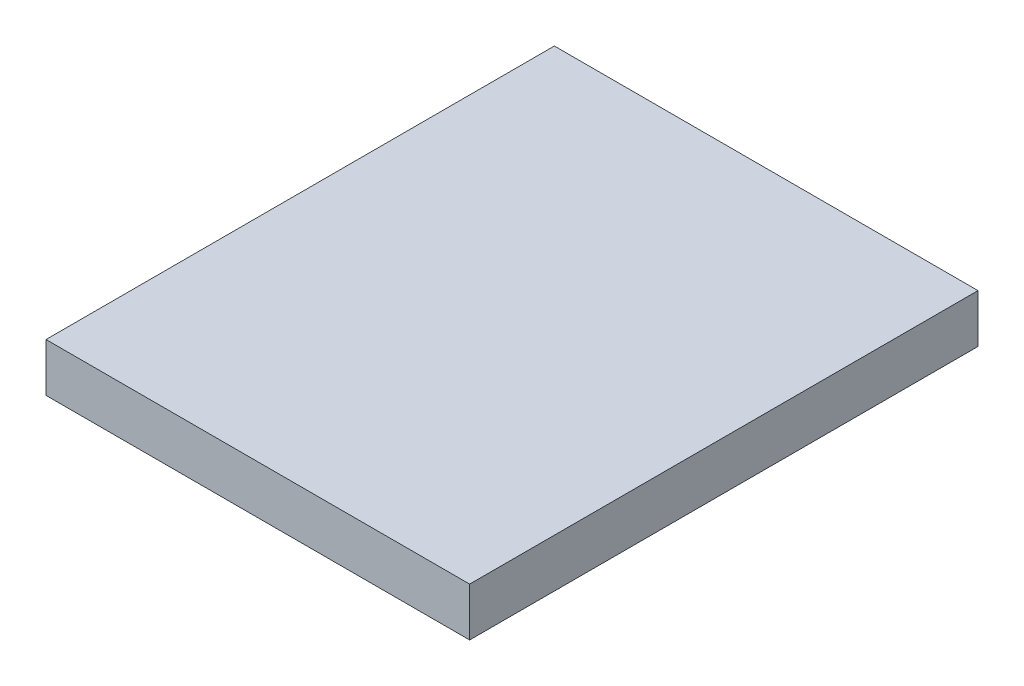
ISO-10303-21;
HEADER;
FILE_DESCRIPTION(('STEP AP214'),'2;1');
FILE_NAME('part.step','',(''),(''),'','','');
FILE_SCHEMA(('AUTOMOTIVE_DESIGN { 1 0 10303 214 1 1 1 1 }'));
ENDSEC;
DATA;
#1=APPLICATION_CONTEXT('core data for automotive mechanical design processes');
#2=APPLICATION_PROTOCOL_DEFINITION('international standard','automotive_design',2000,#1);
#3=PRODUCT_CONTEXT('',#1,'mechanical');
#4=PRODUCT('Part','Part','',(#3));
#5=PRODUCT_RELATED_PRODUCT_CATEGORY('part','',(#4));
#6=PRODUCT_DEFINITION_FORMATION('','',#4);
#7=PRODUCT_DEFINITION_CONTEXT('part definition',#1,'design');
#8=PRODUCT_DEFINITION('design','',#6,#7);
#9=PRODUCT_DEFINITION_SHAPE('','',#8);
#10=(LENGTH_UNIT() NAMED_UNIT(*) SI_UNIT(.MILLI.,.METRE.));
#11=(NAMED_UNIT(*) PLANE_ANGLE_UNIT() SI_UNIT($,.RADIAN.));
#12=(NAMED_UNIT(*) SI_UNIT($,.STERADIAN.) SOLID_ANGLE_UNIT());
#13=UNCERTAINTY_MEASURE_WITH_UNIT(LENGTH_MEASURE(1.E-05),#10,'distance_accuracy_value','');
#14=(GEOMETRIC_REPRESENTATION_CONTEXT(3) GLOBAL_UNCERTAINTY_ASSIGNED_CONTEXT((#13)) GLOBAL_UNIT_ASSIGNED_CONTEXT((#10,
#11,#12)) REPRESENTATION_CONTEXT('',''));
#15=CARTESIAN_POINT('',(0.,0.,0.));
#16=DIRECTION('',(0.,0.,1.));
#17=DIRECTION('',(1.,0.,0.));
#18=AXIS2_PLACEMENT_3D('',#15,#16,#17);
#19=CARTESIAN_POINT('',(0.,4.,0.));
#20=DIRECTION('',(1.,0.,0.));
#21=DIRECTION('',(0.,0.,-1.));
#22=AXIS2_PLACEMENT_3D('',#19,#20,#21);
#23=PLANE('',#22);
#24=DIRECTION('',(0.,0.,1.));
#25=VECTOR('',#24,1.);
#26=CARTESIAN_POINT('',(0.,0.,0.));
#27=LINE('',#26,#25);
#28=CARTESIAN_POINT('',(0.,0.,-42.));
#29=VERTEX_POINT('',#28);
#30=CARTESIAN_POINT('',(0.,0.,0.));
#31=VERTEX_POINT('',#30);
#32=EDGE_CURVE('E96',#29,#31,#27,.T.);
#33=ORIENTED_EDGE('',*,*,#32,.T.);
#34=DIRECTION('',(0.,-1.,0.));
#35=VECTOR('',#34,1.);
#36=CARTESIAN_POINT('',(0.,4.,0.));
#37=LINE('',#36,#35);
#38=CARTESIAN_POINT('',(0.,4.,0.));
#39=VERTEX_POINT('',#38);
#40=EDGE_CURVE('E11',#39,#31,#37,.T.);
#41=ORIENTED_EDGE('',*,*,#40,.F.);
#42=DIRECTION('',(0.,0.,1.));
#43=VECTOR('',#42,1.);
#44=CARTESIAN_POINT('',(0.,4.,0.));
#45=LINE('',#44,#43);
#46=CARTESIAN_POINT('',(0.,4.,-42.));
#47=VERTEX_POINT('',#46);
#48=EDGE_CURVE('E84',#47,#39,#45,.T.);
#49=ORIENTED_EDGE('',*,*,#48,.F.);
#50=DIRECTION('',(0.,-1.,0.));
#51=VECTOR('',#50,1.);
#52=CARTESIAN_POINT('',(0.,4.,-42.));
#53=LINE('',#52,#51);
#54=EDGE_CURVE('E92',#47,#29,#53,.T.);
#55=ORIENTED_EDGE('',*,*,#54,.T.);
#56=EDGE_LOOP('',(#33,#41,#49,#55));
#57=FACE_BOUND('',#56,.T.);
#58=ADVANCED_FACE('F33',(#57),#23,.F.);
#59=CARTESIAN_POINT('',(0.,4.,0.));
#60=DIRECTION('',(0.,0.,-1.));
#61=DIRECTION('',(-1.,0.,0.));
#62=AXIS2_PLACEMENT_3D('',#59,#60,#61);
#63=PLANE('',#62);
#64=DIRECTION('',(1.,0.,0.));
#65=VECTOR('',#64,1.);
#66=CARTESIAN_POINT('',(0.,0.,0.));
#67=LINE('',#66,#65);
#68=CARTESIAN_POINT('',(35.,0.,0.));
#69=VERTEX_POINT('',#68);
#70=EDGE_CURVE('E88',#31,#69,#67,.T.);
#71=ORIENTED_EDGE('',*,*,#70,.T.);
#72=DIRECTION('',(0.,-1.,0.));
#73=VECTOR('',#72,1.);
#74=CARTESIAN_POINT('',(35.,4.,0.));
#75=LINE('',#74,#73);
#76=CARTESIAN_POINT('',(35.,4.,0.));
#77=VERTEX_POINT('',#76);
#78=EDGE_CURVE('E41',#77,#69,#75,.T.);
#79=ORIENTED_EDGE('',*,*,#78,.F.);
#80=DIRECTION('',(1.,0.,0.));
#81=VECTOR('',#80,1.);
#82=CARTESIAN_POINT('',(0.,4.,0.));
#83=LINE('',#82,#81);
#84=EDGE_CURVE('E79',#39,#77,#83,.T.);
#85=ORIENTED_EDGE('',*,*,#84,.F.);
#86=ORIENTED_EDGE('',*,*,#40,.T.);
#87=EDGE_LOOP('',(#71,#79,#85,#86));
#88=FACE_BOUND('',#87,.T.);
#89=ADVANCED_FACE('F87',(#88),#63,.F.);
#90=CARTESIAN_POINT('',(35.,4.,0.));
#91=DIRECTION('',(-1.,0.,0.));
#92=DIRECTION('',(0.,0.,1.));
#93=AXIS2_PLACEMENT_3D('',#90,#91,#92);
#94=PLANE('',#93);
#95=DIRECTION('',(0.,0.,-1.));
#96=VECTOR('',#95,1.);
#97=CARTESIAN_POINT('',(35.,0.,0.));
#98=LINE('',#97,#96);
#99=CARTESIAN_POINT('',(35.,0.,-42.));
#100=VERTEX_POINT('',#99);
#101=EDGE_CURVE('E66',#69,#100,#98,.T.);
#102=ORIENTED_EDGE('',*,*,#101,.T.);
#103=DIRECTION('',(0.,-1.,0.));
#104=VECTOR('',#103,1.);
#105=CARTESIAN_POINT('',(35.,4.,-42.));
#106=LINE('',#105,#104);
#107=CARTESIAN_POINT('',(35.,4.,-42.));
#108=VERTEX_POINT('',#107);
#109=EDGE_CURVE('E89',#108,#100,#106,.T.);
#110=ORIENTED_EDGE('',*,*,#109,.F.);
#111=DIRECTION('',(0.,0.,-1.));
#112=VECTOR('',#111,1.);
#113=CARTESIAN_POINT('',(35.,4.,0.));
#114=LINE('',#113,#112);
#115=EDGE_CURVE('E82',#77,#108,#114,.T.);
#116=ORIENTED_EDGE('',*,*,#115,.F.);
#117=ORIENTED_EDGE('',*,*,#78,.T.);
#118=EDGE_LOOP('',(#102,#110,#116,#117));
#119=FACE_BOUND('',#118,.T.);
#120=ADVANCED_FACE('F90',(#119),#94,.F.);
#121=CARTESIAN_POINT('',(0.,4.,-42.));
#122=DIRECTION('',(0.,0.,1.));
#123=DIRECTION('',(1.,0.,0.));
#124=AXIS2_PLACEMENT_3D('',#121,#122,#123);
#125=PLANE('',#124);
#126=DIRECTION('',(-1.,0.,0.));
#127=VECTOR('',#126,1.);
#128=CARTESIAN_POINT('',(0.,0.,-42.));
#129=LINE('',#128,#127);
#130=EDGE_CURVE('E72',#100,#29,#129,.T.);
#131=ORIENTED_EDGE('',*,*,#130,.T.);
#132=ORIENTED_EDGE('',*,*,#54,.F.);
#133=DIRECTION('',(-1.,0.,0.));
#134=VECTOR('',#133,1.);
#135=CARTESIAN_POINT('',(0.,4.,-42.));
#136=LINE('',#135,#134);
#137=EDGE_CURVE('E49',#108,#47,#136,.T.);
#138=ORIENTED_EDGE('',*,*,#137,.F.);
#139=ORIENTED_EDGE('',*,*,#109,.T.);
#140=EDGE_LOOP('',(#131,#132,#138,#139));
#141=FACE_BOUND('',#140,.T.);
#142=ADVANCED_FACE('F103',(#141),#125,.F.);
#143=CARTESIAN_POINT('',(0.,4.,0.));
#144=DIRECTION('',(0.,-1.,0.));
#145=DIRECTION('',(0.,0.,-1.));
#146=AXIS2_PLACEMENT_3D('',#143,#144,#145);
#147=PLANE('',#146);
#148=ORIENTED_EDGE('',*,*,#48,.T.);
#149=ORIENTED_EDGE('',*,*,#84,.T.);
#150=ORIENTED_EDGE('',*,*,#115,.T.);
#151=ORIENTED_EDGE('',*,*,#137,.T.);
#152=EDGE_LOOP('',(#148,#149,#150,#151));
#153=FACE_BOUND('',#152,.T.);
#154=ADVANCED_FACE('F80',(#153),#147,.F.);
#155=CARTESIAN_POINT('',(0.,0.,0.));
#156=DIRECTION('',(0.,-1.,0.));
#157=DIRECTION('',(0.,0.,-1.));
#158=AXIS2_PLACEMENT_3D('',#155,#156,#157);
#159=PLANE('',#158);
#160=ORIENTED_EDGE('',*,*,#32,.F.);
#161=ORIENTED_EDGE('',*,*,#130,.F.);
#162=ORIENTED_EDGE('',*,*,#101,.F.);
#163=ORIENTED_EDGE('',*,*,#70,.F.);
#164=EDGE_LOOP('',(#160,#161,#162,#163));
#165=FACE_BOUND('',#164,.T.);
#166=ADVANCED_FACE('F106',(#165),#159,.T.);
#167=CLOSED_SHELL('',(#58,#89,#120,#142,#154,#166));
#168=MANIFOLD_SOLID_BREP('B2',#167);
#169=ADVANCED_BREP_SHAPE_REPRESENTATION('',(#18,#168),#14);
#170=SHAPE_DEFINITION_REPRESENTATION(#9,#169);
ENDSEC;
END-ISO-10303-21;
